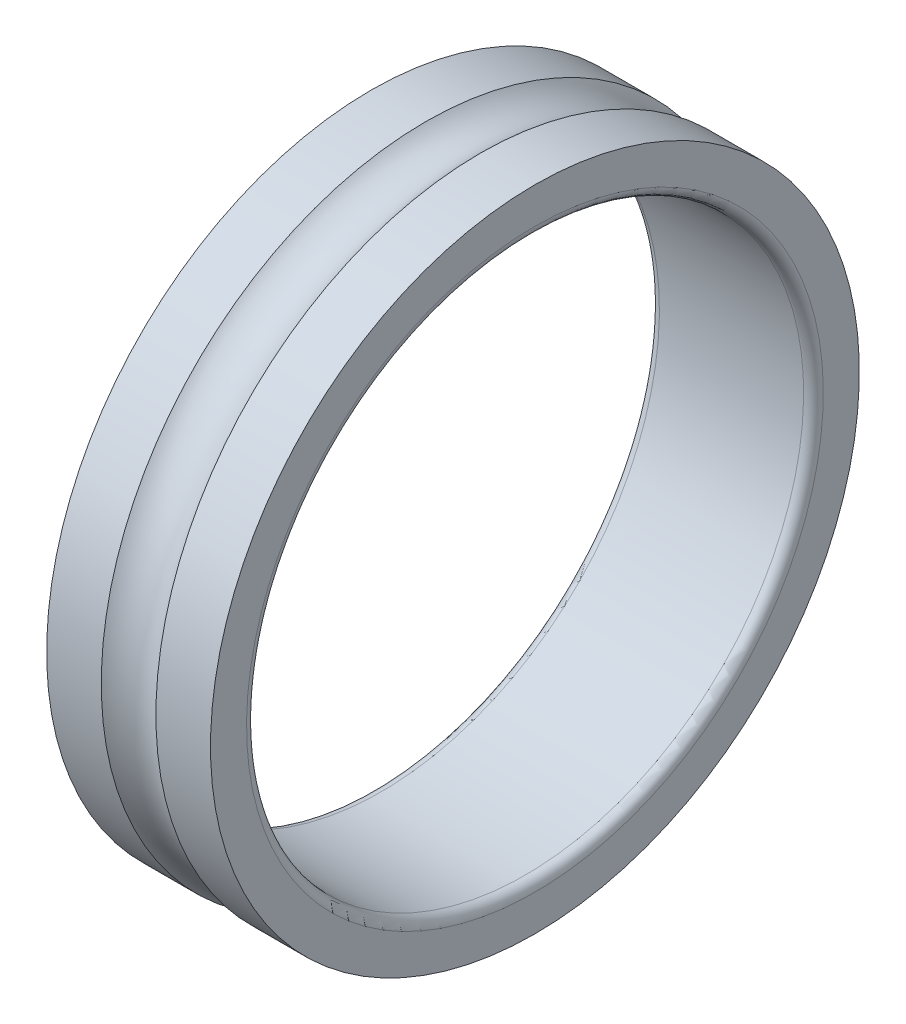
ISO-10303-21;
HEADER;
FILE_DESCRIPTION(('STEP AP214'),'2;1');
FILE_NAME('part.step','',(''),(''),'','','');
FILE_SCHEMA(('AUTOMOTIVE_DESIGN { 1 0 10303 214 1 1 1 1 }'));
ENDSEC;
DATA;
#1=APPLICATION_CONTEXT('core data for automotive mechanical design processes');
#2=APPLICATION_PROTOCOL_DEFINITION('international standard','automotive_design',2000,#1);
#3=PRODUCT_CONTEXT('',#1,'mechanical');
#4=PRODUCT('Part','Part','',(#3));
#5=PRODUCT_RELATED_PRODUCT_CATEGORY('part','',(#4));
#6=PRODUCT_DEFINITION_FORMATION('','',#4);
#7=PRODUCT_DEFINITION_CONTEXT('part definition',#1,'design');
#8=PRODUCT_DEFINITION('design','',#6,#7);
#9=PRODUCT_DEFINITION_SHAPE('','',#8);
#10=(LENGTH_UNIT() NAMED_UNIT(*) SI_UNIT(.MILLI.,.METRE.));
#11=(NAMED_UNIT(*) PLANE_ANGLE_UNIT() SI_UNIT($,.RADIAN.));
#12=(NAMED_UNIT(*) SI_UNIT($,.STERADIAN.) SOLID_ANGLE_UNIT());
#13=UNCERTAINTY_MEASURE_WITH_UNIT(LENGTH_MEASURE(1.E-05),#10,'distance_accuracy_value','');
#14=(GEOMETRIC_REPRESENTATION_CONTEXT(3) GLOBAL_UNCERTAINTY_ASSIGNED_CONTEXT((#13)) GLOBAL_UNIT_ASSIGNED_CONTEXT((#10,
#11,#12)) REPRESENTATION_CONTEXT('',''));
#15=CARTESIAN_POINT('',(0.,0.,0.));
#16=DIRECTION('',(0.,0.,1.));
#17=DIRECTION('',(1.,0.,0.));
#18=AXIS2_PLACEMENT_3D('',#15,#16,#17);
#19=CARTESIAN_POINT('',(4.16677039542174,0.,0.));
#20=DIRECTION('',(-1.,0.,0.));
#21=DIRECTION('',(0.,1.,0.));
#22=AXIS2_PLACEMENT_3D('',#19,#20,#21);
#23=CYLINDRICAL_SURFACE('',#22,9.9);
#24=CARTESIAN_POINT('',(3.33354079084349,0.,0.));
#25=DIRECTION('',(1.,0.,0.));
#26=DIRECTION('',(0.,1.,0.));
#27=AXIS2_PLACEMENT_3D('',#24,#25,#26);
#28=CIRCLE('',#27,9.9);
#29=CARTESIAN_POINT('',(3.33354079084349,9.9,0.));
#30=VERTEX_POINT('',#29);
#31=EDGE_CURVE('E11',#30,#30,#28,.T.);
#32=ORIENTED_EDGE('',*,*,#31,.T.);
#33=EDGE_LOOP('',(#32));
#34=FACE_BOUND('',#33,.T.);
#35=CARTESIAN_POINT('',(5.,0.,0.));
#36=DIRECTION('',(1.,0.,0.));
#37=DIRECTION('',(0.,1.,0.));
#38=AXIS2_PLACEMENT_3D('',#35,#36,#37);
#39=CIRCLE('',#38,9.9);
#40=CARTESIAN_POINT('',(5.,9.9,0.));
#41=VERTEX_POINT('',#40);
#42=EDGE_CURVE('E64',#41,#41,#39,.T.);
#43=ORIENTED_EDGE('',*,*,#42,.F.);
#44=EDGE_LOOP('',(#43));
#45=FACE_BOUND('',#44,.T.);
#46=ADVANCED_FACE('F16',(#34,#45),#23,.T.);
#47=CARTESIAN_POINT('',(2.5,0.,0.));
#48=DIRECTION('',(1.,0.,0.));
#49=DIRECTION('',(0.,0.,-1.));
#50=AXIS2_PLACEMENT_3D('',#47,#48,#49);
#51=TOROIDAL_SURFACE('',#50,10.75,1.1905);
#52=CARTESIAN_POINT('',(1.66645920915651,0.,0.));
#53=DIRECTION('',(1.,0.,0.));
#54=DIRECTION('',(0.,1.,0.));
#55=AXIS2_PLACEMENT_3D('',#52,#53,#54);
#56=CIRCLE('',#55,9.9);
#57=CARTESIAN_POINT('',(1.66645920915651,9.9,0.));
#58=VERTEX_POINT('',#57);
#59=EDGE_CURVE('E27',#58,#58,#56,.T.);
#60=ORIENTED_EDGE('',*,*,#59,.T.);
#61=EDGE_LOOP('',(#60));
#62=FACE_BOUND('',#61,.T.);
#63=ORIENTED_EDGE('',*,*,#31,.F.);
#64=EDGE_LOOP('',(#63));
#65=FACE_BOUND('',#64,.T.);
#66=ADVANCED_FACE('F94',(#62,#65),#51,.F.);
#67=CARTESIAN_POINT('',(0.833229604578254,0.,0.));
#68=DIRECTION('',(-1.,0.,0.));
#69=DIRECTION('',(0.,1.,0.));
#70=AXIS2_PLACEMENT_3D('',#67,#68,#69);
#71=CYLINDRICAL_SURFACE('',#70,9.9);
#72=CARTESIAN_POINT('',(0.,0.,0.));
#73=DIRECTION('',(1.,0.,0.));
#74=DIRECTION('',(0.,1.,0.));
#75=AXIS2_PLACEMENT_3D('',#72,#73,#74);
#76=CIRCLE('',#75,9.9);
#77=CARTESIAN_POINT('',(0.,9.9,0.));
#78=VERTEX_POINT('',#77);
#79=EDGE_CURVE('E51',#78,#78,#76,.T.);
#80=ORIENTED_EDGE('',*,*,#79,.T.);
#81=EDGE_LOOP('',(#80));
#82=FACE_BOUND('',#81,.T.);
#83=ORIENTED_EDGE('',*,*,#59,.F.);
#84=EDGE_LOOP('',(#83));
#85=FACE_BOUND('',#84,.T.);
#86=ADVANCED_FACE('F52',(#82,#85),#71,.T.);
#87=CARTESIAN_POINT('',(0.,9.35,0.));
#88=DIRECTION('',(-1.,0.,0.));
#89=DIRECTION('',(0.,-1.,0.));
#90=AXIS2_PLACEMENT_3D('',#87,#88,#89);
#91=PLANE('',#90);
#92=CARTESIAN_POINT('',(0.,0.,0.));
#93=DIRECTION('',(1.,0.,0.));
#94=DIRECTION('',(0.,1.,0.));
#95=AXIS2_PLACEMENT_3D('',#92,#93,#94);
#96=CIRCLE('',#95,8.8);
#97=CARTESIAN_POINT('',(0.,8.8,0.));
#98=VERTEX_POINT('',#97);
#99=EDGE_CURVE('E20',#98,#98,#96,.T.);
#100=ORIENTED_EDGE('',*,*,#99,.T.);
#101=EDGE_LOOP('',(#100));
#102=FACE_BOUND('',#101,.T.);
#103=ORIENTED_EDGE('',*,*,#79,.F.);
#104=EDGE_LOOP('',(#103));
#105=FACE_BOUND('',#104,.T.);
#106=ADVANCED_FACE('F91',(#102,#105),#91,.T.);
#107=CARTESIAN_POINT('',(0.3,0.,0.));
#108=DIRECTION('',(1.,0.,0.));
#109=DIRECTION('',(0.,0.,-1.));
#110=AXIS2_PLACEMENT_3D('',#107,#108,#109);
#111=TOROIDAL_SURFACE('',#110,8.8,0.3);
#112=CARTESIAN_POINT('',(0.3,0.,0.));
#113=DIRECTION('',(1.,0.,0.));
#114=DIRECTION('',(0.,1.,0.));
#115=AXIS2_PLACEMENT_3D('',#112,#113,#114);
#116=CIRCLE('',#115,8.5);
#117=CARTESIAN_POINT('',(0.3,8.5,0.));
#118=VERTEX_POINT('',#117);
#119=EDGE_CURVE('E62',#118,#118,#116,.T.);
#120=ORIENTED_EDGE('',*,*,#119,.T.);
#121=EDGE_LOOP('',(#120));
#122=FACE_BOUND('',#121,.T.);
#123=ORIENTED_EDGE('',*,*,#99,.F.);
#124=EDGE_LOOP('',(#123));
#125=FACE_BOUND('',#124,.T.);
#126=ADVANCED_FACE('F79',(#122,#125),#111,.T.);
#127=CARTESIAN_POINT('',(2.5,0.,0.));
#128=DIRECTION('',(-1.,0.,0.));
#129=DIRECTION('',(0.,1.,0.));
#130=AXIS2_PLACEMENT_3D('',#127,#128,#129);
#131=CYLINDRICAL_SURFACE('',#130,8.5);
#132=CARTESIAN_POINT('',(4.7,0.,0.));
#133=DIRECTION('',(1.,0.,0.));
#134=DIRECTION('',(0.,1.,0.));
#135=AXIS2_PLACEMENT_3D('',#132,#133,#134);
#136=CIRCLE('',#135,8.5);
#137=CARTESIAN_POINT('',(4.7,8.5,0.));
#138=VERTEX_POINT('',#137);
#139=EDGE_CURVE('E66',#138,#138,#136,.T.);
#140=ORIENTED_EDGE('',*,*,#139,.T.);
#141=EDGE_LOOP('',(#140));
#142=FACE_BOUND('',#141,.T.);
#143=ORIENTED_EDGE('',*,*,#119,.F.);
#144=EDGE_LOOP('',(#143));
#145=FACE_BOUND('',#144,.T.);
#146=ADVANCED_FACE('F18',(#142,#145),#131,.F.);
#147=CARTESIAN_POINT('',(4.7,0.,0.));
#148=DIRECTION('',(1.,0.,0.));
#149=DIRECTION('',(0.,0.,-1.));
#150=AXIS2_PLACEMENT_3D('',#147,#148,#149);
#151=TOROIDAL_SURFACE('',#150,8.8,0.3);
#152=CARTESIAN_POINT('',(5.,0.,0.));
#153=DIRECTION('',(1.,0.,0.));
#154=DIRECTION('',(0.,1.,0.));
#155=AXIS2_PLACEMENT_3D('',#152,#153,#154);
#156=CIRCLE('',#155,8.8);
#157=CARTESIAN_POINT('',(5.,8.8,0.));
#158=VERTEX_POINT('',#157);
#159=EDGE_CURVE('E67',#158,#158,#156,.T.);
#160=ORIENTED_EDGE('',*,*,#159,.T.);
#161=EDGE_LOOP('',(#160));
#162=FACE_BOUND('',#161,.T.);
#163=ORIENTED_EDGE('',*,*,#139,.F.);
#164=EDGE_LOOP('',(#163));
#165=FACE_BOUND('',#164,.T.);
#166=ADVANCED_FACE('F83',(#162,#165),#151,.T.);
#167=CARTESIAN_POINT('',(5.,9.35,0.));
#168=DIRECTION('',(1.,0.,0.));
#169=DIRECTION('',(0.,1.,0.));
#170=AXIS2_PLACEMENT_3D('',#167,#168,#169);
#171=PLANE('',#170);
#172=ORIENTED_EDGE('',*,*,#42,.T.);
#173=EDGE_LOOP('',(#172));
#174=FACE_BOUND('',#173,.T.);
#175=ORIENTED_EDGE('',*,*,#159,.F.);
#176=EDGE_LOOP('',(#175));
#177=FACE_BOUND('',#176,.T.);
#178=ADVANCED_FACE('F90',(#174,#177),#171,.T.);
#179=CLOSED_SHELL('',(#46,#66,#86,#106,#126,#146,#166,#178));
#180=MANIFOLD_SOLID_BREP('B1',#179);
#181=ADVANCED_BREP_SHAPE_REPRESENTATION('',(#18,#180),#14);
#182=SHAPE_DEFINITION_REPRESENTATION(#9,#181);
ENDSEC;
END-ISO-10303-21;
